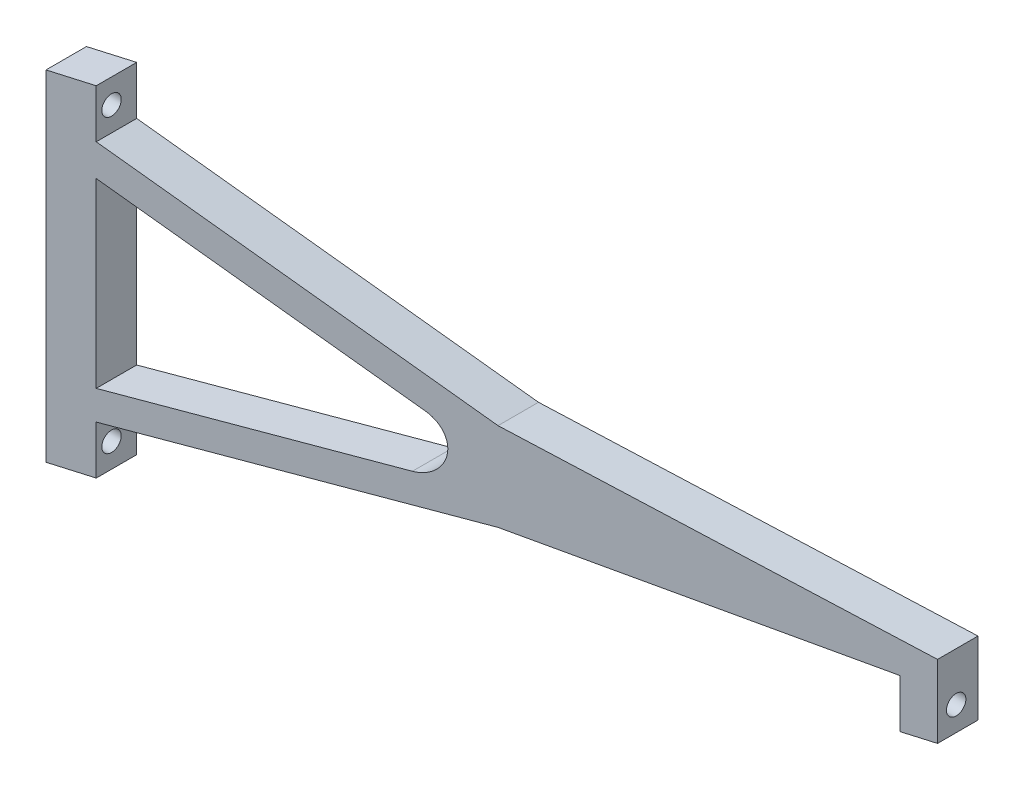
ISO-10303-21;
HEADER;
FILE_DESCRIPTION(('STEP AP214'),'2;1');
FILE_NAME('part.step','',(''),(''),'','','');
FILE_SCHEMA(('AUTOMOTIVE_DESIGN { 1 0 10303 214 1 1 1 1 }'));
ENDSEC;
DATA;
#1=APPLICATION_CONTEXT('core data for automotive mechanical design processes');
#2=APPLICATION_PROTOCOL_DEFINITION('international standard','automotive_design',2000,#1);
#3=PRODUCT_CONTEXT('',#1,'mechanical');
#4=PRODUCT('Part','Part','',(#3));
#5=PRODUCT_RELATED_PRODUCT_CATEGORY('part','',(#4));
#6=PRODUCT_DEFINITION_FORMATION('','',#4);
#7=PRODUCT_DEFINITION_CONTEXT('part definition',#1,'design');
#8=PRODUCT_DEFINITION('design','',#6,#7);
#9=PRODUCT_DEFINITION_SHAPE('','',#8);
#10=(LENGTH_UNIT() NAMED_UNIT(*) SI_UNIT(.MILLI.,.METRE.));
#11=(NAMED_UNIT(*) PLANE_ANGLE_UNIT() SI_UNIT($,.RADIAN.));
#12=(NAMED_UNIT(*) SI_UNIT($,.STERADIAN.) SOLID_ANGLE_UNIT());
#13=UNCERTAINTY_MEASURE_WITH_UNIT(LENGTH_MEASURE(1.E-05),#10,'distance_accuracy_value','');
#14=(GEOMETRIC_REPRESENTATION_CONTEXT(3) GLOBAL_UNCERTAINTY_ASSIGNED_CONTEXT((#13)) GLOBAL_UNIT_ASSIGNED_CONTEXT((#10,
#11,#12)) REPRESENTATION_CONTEXT('',''));
#15=CARTESIAN_POINT('',(0.,0.,0.));
#16=DIRECTION('',(0.,0.,1.));
#17=DIRECTION('',(1.,0.,0.));
#18=AXIS2_PLACEMENT_3D('',#15,#16,#17);
#19=CARTESIAN_POINT('',(-64.,16.0106379265945,30.));
#20=DIRECTION('',(-0.0594690450469109,0.99823015015637,0.));
#21=DIRECTION('',(-0.99823015015637,-0.0594690450469109,0.));
#22=AXIS2_PLACEMENT_3D('',#19,#20,#21);
#23=PLANE('',#22);
#24=DIRECTION('',(0.957987763405682,0.0570716256641193,-0.28107343294775));
#25=VECTOR('',#24,1.);
#26=CARTESIAN_POINT('',(-69.5695897519318,15.6788324969563,10.949691869991));
#27=LINE('',#26,#25);
#28=CARTESIAN_POINT('',(-64.,16.0106379265945,9.31557526486776));
#29=VERTEX_POINT('',#28);
#30=CARTESIAN_POINT('',(-13.6431857297185,19.0106190990618,-5.45910474664132));
#31=VERTEX_POINT('',#30);
#32=EDGE_CURVE('E12',#29,#31,#27,.T.);
#33=ORIENTED_EDGE('',*,*,#32,.F.);
#34=DIRECTION('',(0.,0.,-1.));
#35=VECTOR('',#34,1.);
#36=CARTESIAN_POINT('',(-64.,16.0106379265945,30.));
#37=LINE('',#36,#35);
#38=CARTESIAN_POINT('',(-64.,16.0106379265945,17.6528014767243));
#39=VERTEX_POINT('',#38);
#40=EDGE_CURVE('E213',#39,#29,#37,.T.);
#41=ORIENTED_EDGE('',*,*,#40,.F.);
#42=DIRECTION('',(-0.957987763405682,-0.0570716256641193,0.281073432947749));
#43=VECTOR('',#42,1.);
#44=CARTESIAN_POINT('',(-67.324667291496,15.8125725917687,18.6282582463471));
#45=LINE('',#44,#43);
#46=CARTESIAN_POINT('',(-13.6431857297185,19.0106190990618,2.87812146521523));
#47=VERTEX_POINT('',#46);
#48=EDGE_CURVE('E44',#47,#39,#45,.T.);
#49=ORIENTED_EDGE('',*,*,#48,.F.);
#50=DIRECTION('',(0.,0.,-1.));
#51=VECTOR('',#50,1.);
#52=CARTESIAN_POINT('',(-13.6431857297185,19.0106190990618,30.));
#53=LINE('',#52,#51);
#54=EDGE_CURVE('E219',#47,#31,#53,.T.);
#55=ORIENTED_EDGE('',*,*,#54,.T.);
#56=EDGE_LOOP('',(#33,#41,#49,#55));
#57=FACE_BOUND('',#56,.T.);
#58=ADVANCED_FACE('F36',(#57),#23,.T.);
#59=CARTESIAN_POINT('',(-64.,53.4497295583817,30.));
#60=DIRECTION('',(1.,0.,0.));
#61=DIRECTION('',(0.,0.,-1.));
#62=AXIS2_PLACEMENT_3D('',#59,#60,#61);
#63=PLANE('',#62);
#64=DIRECTION('',(0.,-1.,0.));
#65=VECTOR('',#64,1.);
#66=CARTESIAN_POINT('',(-64.,53.4497295583817,9.31557526486777));
#67=LINE('',#66,#65);
#68=CARTESIAN_POINT('',(-64.,53.4497295583817,9.31557526486777));
#69=VERTEX_POINT('',#68);
#70=EDGE_CURVE('E281',#69,#29,#67,.T.);
#71=ORIENTED_EDGE('',*,*,#70,.F.);
#72=DIRECTION('',(0.,0.,-1.));
#73=VECTOR('',#72,1.);
#74=CARTESIAN_POINT('',(-64.,53.4497295583817,30.));
#75=LINE('',#74,#73);
#76=CARTESIAN_POINT('',(-64.,53.4497295583817,17.6528014767243));
#77=VERTEX_POINT('',#76);
#78=EDGE_CURVE('E215',#77,#69,#75,.T.);
#79=ORIENTED_EDGE('',*,*,#78,.F.);
#80=DIRECTION('',(0.,1.,0.));
#81=VECTOR('',#80,1.);
#82=CARTESIAN_POINT('',(-64.,53.4497295583817,17.6528014767243));
#83=LINE('',#82,#81);
#84=EDGE_CURVE('E157',#39,#77,#83,.T.);
#85=ORIENTED_EDGE('',*,*,#84,.F.);
#86=ORIENTED_EDGE('',*,*,#40,.T.);
#87=EDGE_LOOP('',(#71,#79,#85,#86));
#88=FACE_BOUND('',#87,.T.);
#89=ADVANCED_FACE('F212',(#88),#63,.T.);
#90=CARTESIAN_POINT('',(-11.5928306007203,30.4959562846853,30.));
#91=DIRECTION('',(-0.401194899879948,-0.915992714114211,0.));
#92=DIRECTION('',(0.915992714114211,-0.401194899879948,0.));
#93=AXIS2_PLACEMENT_3D('',#90,#91,#92);
#94=PLANE('',#93);
#95=DIRECTION('',(-0.884603208938995,0.387446636174346,0.259542418213318));
#96=VECTOR('',#95,1.);
#97=CARTESIAN_POINT('',(-19.8720759330204,34.1221761781325,-3.63154951078674));
#98=LINE('',#97,#96);
#99=CARTESIAN_POINT('',(-11.5928306007203,30.4959562846853,-6.06067856301324));
#100=VERTEX_POINT('',#99);
#101=EDGE_CURVE('E283',#100,#69,#98,.T.);
#102=ORIENTED_EDGE('',*,*,#101,.F.);
#103=DIRECTION('',(0.,0.,-1.));
#104=VECTOR('',#103,1.);
#105=CARTESIAN_POINT('',(-11.5928306007203,30.4959562846853,30.));
#106=LINE('',#105,#104);
#107=CARTESIAN_POINT('',(-11.5928306007203,30.4959562846853,2.2765476488433));
#108=VERTEX_POINT('',#107);
#109=EDGE_CURVE('E221',#108,#100,#106,.T.);
#110=ORIENTED_EDGE('',*,*,#109,.F.);
#111=DIRECTION('',(0.884603208938995,-0.387446636174346,-0.259542418213318));
#112=VECTOR('',#111,1.);
#113=CARTESIAN_POINT('',(-17.9579150256424,33.2837944074519,4.14406224418109));
#114=LINE('',#113,#112);
#115=EDGE_CURVE('E216',#77,#108,#114,.T.);
#116=ORIENTED_EDGE('',*,*,#115,.F.);
#117=ORIENTED_EDGE('',*,*,#78,.T.);
#118=EDGE_LOOP('',(#102,#110,#116,#117));
#119=FACE_BOUND('',#118,.T.);
#120=ADVANCED_FACE('F323',(#119),#94,.T.);
#121=CARTESIAN_POINT('',(-14.,25.,30.));
#122=DIRECTION('',(0.,0.,-1.));
#123=DIRECTION('',(-1.,0.,0.));
#124=AXIS2_PLACEMENT_3D('',#121,#122,#123);
#125=CYLINDRICAL_SURFACE('',#124,6.);
#126=CARTESIAN_POINT('',(-14.,25.,-5.35441550560528));
#127=DIRECTION('',(0.281532306264845,0.,0.959551749792161));
#128=DIRECTION('',(0.959551749792161,0.,-0.281532306264845));
#129=AXIS2_PLACEMENT_3D('',#126,#127,#128);
#130=ELLIPSE('',#129,6.25291965889239,6.);
#131=EDGE_CURVE('E285',#31,#100,#130,.T.);
#132=ORIENTED_EDGE('',*,*,#131,.F.);
#133=ORIENTED_EDGE('',*,*,#54,.F.);
#134=CARTESIAN_POINT('',(-14.,25.,2.98281070625127));
#135=DIRECTION('',(-0.281532306264845,0.,-0.959551749792161));
#136=DIRECTION('',(0.959551749792161,0.,-0.281532306264845));
#137=AXIS2_PLACEMENT_3D('',#134,#135,#136);
#138=ELLIPSE('',#137,6.25291965889239,6.);
#139=EDGE_CURVE('E203',#108,#47,#138,.T.);
#140=ORIENTED_EDGE('',*,*,#139,.F.);
#141=ORIENTED_EDGE('',*,*,#109,.T.);
#142=EDGE_LOOP('',(#132,#133,#140,#141));
#143=FACE_BOUND('',#142,.T.);
#144=ADVANCED_FACE('F330',(#143),#125,.F.);
#145=CARTESIAN_POINT('',(70.,70.,-21.6627737881434));
#146=DIRECTION('',(-0.281532306264845,0.,-0.959551749792161));
#147=DIRECTION('',(-0.959551749792161,0.,0.281532306264845));
#148=AXIS2_PLACEMENT_3D('',#145,#146,#147);
#149=PLANE('',#148);
#150=ORIENTED_EDGE('',*,*,#139,.T.);
#151=ORIENTED_EDGE('',*,*,#48,.T.);
#152=ORIENTED_EDGE('',*,*,#84,.T.);
#153=ORIENTED_EDGE('',*,*,#115,.T.);
#154=EDGE_LOOP('',(#150,#151,#152,#153));
#155=FACE_BOUND('',#154,.T.);
#156=DIRECTION('',(0.884603208938995,-0.387446636174346,-0.259542418213318));
#157=VECTOR('',#156,1.);
#158=CARTESIAN_POINT('',(-7.14600377341808,35.0985646802269,0.971849478554998));
#159=LINE('',#158,#157);
#160=CARTESIAN_POINT('',(-64.,60.,17.6528014767243));
#161=VERTEX_POINT('',#160);
#162=CARTESIAN_POINT('',(0.,31.9686923305427,-1.12478670948118));
#163=VERTEX_POINT('',#162);
#164=EDGE_CURVE('E275',#161,#163,#159,.T.);
#165=ORIENTED_EDGE('',*,*,#164,.F.);
#166=DIRECTION('',(0.,-1.,0.));
#167=VECTOR('',#166,1.);
#168=CARTESIAN_POINT('',(-64.,60.,17.6528014767243));
#169=LINE('',#168,#167);
#170=CARTESIAN_POINT('',(-64.,70.,17.6528014767243));
#171=VERTEX_POINT('',#170);
#172=EDGE_CURVE('E272',#171,#161,#169,.T.);
#173=ORIENTED_EDGE('',*,*,#172,.F.);
#174=DIRECTION('',(0.959551749792161,0.,-0.281532306264845));
#175=VECTOR('',#174,1.);
#176=CARTESIAN_POINT('',(70.,70.,-21.6627737881434));
#177=LINE('',#176,#175);
#178=CARTESIAN_POINT('',(-72.,70.,20.));
#179=VERTEX_POINT('',#178);
#180=EDGE_CURVE('E168',#179,#171,#177,.T.);
#181=ORIENTED_EDGE('',*,*,#180,.F.);
#182=DIRECTION('',(0.,-1.,0.));
#183=VECTOR('',#182,1.);
#184=CARTESIAN_POINT('',(-72.,70.,20.));
#185=LINE('',#184,#183);
#186=CARTESIAN_POINT('',(-72.,0.,20.));
#187=VERTEX_POINT('',#186);
#188=EDGE_CURVE('E158',#179,#187,#185,.T.);
#189=ORIENTED_EDGE('',*,*,#188,.T.);
#190=DIRECTION('',(0.959551749792161,0.,-0.281532306264845));
#191=VECTOR('',#190,1.);
#192=CARTESIAN_POINT('',(70.,0.,-21.6627737881434));
#193=LINE('',#192,#191);
#194=CARTESIAN_POINT('',(-64.,0.,17.6528014767243));
#195=VERTEX_POINT('',#194);
#196=EDGE_CURVE('E169',#187,#195,#193,.T.);
#197=ORIENTED_EDGE('',*,*,#196,.T.);
#198=DIRECTION('',(0.,-1.,0.));
#199=VECTOR('',#198,1.);
#200=CARTESIAN_POINT('',(-64.,0.,17.6528014767243));
#201=LINE('',#200,#199);
#202=CARTESIAN_POINT('',(-64.,10.,17.6528014767243));
#203=VERTEX_POINT('',#202);
#204=EDGE_CURVE('E51',#203,#195,#201,.T.);
#205=ORIENTED_EDGE('',*,*,#204,.F.);
#206=DIRECTION('',(-0.957987763405682,-0.0570716256641194,0.281073432947749));
#207=VECTOR('',#206,1.);
#208=CARTESIAN_POINT('',(-67.324667291496,9.80193466517416,18.6282582463471));
#209=LINE('',#208,#207);
#210=CARTESIAN_POINT('',(0.,13.8127669079181,-1.12478670948117));
#211=VERTEX_POINT('',#210);
#212=EDGE_CURVE('E263',#211,#203,#209,.T.);
#213=ORIENTED_EDGE('',*,*,#212,.F.);
#214=DIRECTION('',(-0.957987763405682,0.0570716256641194,0.281073432947749));
#215=VECTOR('',#214,1.);
#216=CARTESIAN_POINT('',(-8.38081287287409,14.3120495014048,1.33414224040131));
#217=LINE('',#216,#215);
#218=CARTESIAN_POINT('',(64.,10.,-19.9023748956867));
#219=VERTEX_POINT('',#218);
#220=EDGE_CURVE('E266',#219,#211,#217,.T.);
#221=ORIENTED_EDGE('',*,*,#220,.F.);
#222=DIRECTION('',(0.,1.,0.));
#223=VECTOR('',#222,1.);
#224=CARTESIAN_POINT('',(64.,10.,-19.9023748956867));
#225=LINE('',#224,#223);
#226=CARTESIAN_POINT('',(64.,0.,-19.9023748956867));
#227=VERTEX_POINT('',#226);
#228=EDGE_CURVE('E269',#227,#219,#225,.T.);
#229=ORIENTED_EDGE('',*,*,#228,.F.);
#230=CARTESIAN_POINT('',(70.,0.,-21.6627737881434));
#231=VERTEX_POINT('',#230);
#232=EDGE_CURVE('E250',#227,#231,#193,.T.);
#233=ORIENTED_EDGE('',*,*,#232,.T.);
#234=DIRECTION('',(0.,-1.,0.));
#235=VECTOR('',#234,1.);
#236=CARTESIAN_POINT('',(70.,70.,-21.6627737881434));
#237=LINE('',#236,#235);
#238=CARTESIAN_POINT('',(70.,15.,-21.6627737881434));
#239=VERTEX_POINT('',#238);
#240=EDGE_CURVE('E257',#239,#231,#237,.T.);
#241=ORIENTED_EDGE('',*,*,#240,.F.);
#242=DIRECTION('',(0.934601477354737,-0.226556641727189,-0.274211900937289));
#243=VECTOR('',#242,1.);
#244=CARTESIAN_POINT('',(56.7599238633365,18.2095254056572,-17.7781378936391));
#245=LINE('',#244,#243);
#246=EDGE_CURVE('E278',#163,#239,#245,.T.);
#247=ORIENTED_EDGE('',*,*,#246,.F.);
#248=EDGE_LOOP('',(#165,#173,#181,#189,#197,#205,#213,#221,#229,#233,#241,#247));
#249=FACE_BOUND('',#248,.T.);
#250=ADVANCED_FACE('F200',(#155,#249),#149,.F.);
#251=CARTESIAN_POINT('',(-72.,70.,11.6627737881435));
#252=DIRECTION('',(0.281532306264845,0.,0.959551749792161));
#253=DIRECTION('',(0.959551749792161,0.,-0.281532306264845));
#254=AXIS2_PLACEMENT_3D('',#251,#252,#253);
#255=PLANE('',#254);
#256=ORIENTED_EDGE('',*,*,#131,.T.);
#257=ORIENTED_EDGE('',*,*,#101,.T.);
#258=ORIENTED_EDGE('',*,*,#70,.T.);
#259=ORIENTED_EDGE('',*,*,#32,.T.);
#260=EDGE_LOOP('',(#256,#257,#258,#259));
#261=FACE_BOUND('',#260,.T.);
#262=DIRECTION('',(0.,1.,0.));
#263=VECTOR('',#262,1.);
#264=CARTESIAN_POINT('',(70.,0.,-30.));
#265=LINE('',#264,#263);
#266=CARTESIAN_POINT('',(70.,0.,-30.));
#267=VERTEX_POINT('',#266);
#268=CARTESIAN_POINT('',(70.,15.,-30.));
#269=VERTEX_POINT('',#268);
#270=EDGE_CURVE('E229',#267,#269,#265,.T.);
#271=ORIENTED_EDGE('',*,*,#270,.F.);
#272=DIRECTION('',(-0.959551749792161,0.,0.281532306264845));
#273=VECTOR('',#272,1.);
#274=CARTESIAN_POINT('',(-72.,0.,11.6627737881435));
#275=LINE('',#274,#273);
#276=CARTESIAN_POINT('',(64.,0.,-28.2396011075432));
#277=VERTEX_POINT('',#276);
#278=EDGE_CURVE('E247',#267,#277,#275,.T.);
#279=ORIENTED_EDGE('',*,*,#278,.T.);
#280=DIRECTION('',(0.,-1.,0.));
#281=VECTOR('',#280,1.);
#282=CARTESIAN_POINT('',(64.,10.,-28.2396011075432));
#283=LINE('',#282,#281);
#284=CARTESIAN_POINT('',(64.,10.,-28.2396011075432));
#285=VERTEX_POINT('',#284);
#286=EDGE_CURVE('E291',#285,#277,#283,.T.);
#287=ORIENTED_EDGE('',*,*,#286,.F.);
#288=DIRECTION('',(0.957987763405682,-0.0570716256641194,-0.28107343294775));
#289=VECTOR('',#288,1.);
#290=CARTESIAN_POINT('',(-10.62573533331,14.4457895962171,-6.3444241359548));
#291=LINE('',#290,#289);
#292=CARTESIAN_POINT('',(0.,13.8127669079181,-9.46201292133772));
#293=VERTEX_POINT('',#292);
#294=EDGE_CURVE('E59',#293,#285,#291,.T.);
#295=ORIENTED_EDGE('',*,*,#294,.F.);
#296=DIRECTION('',(0.957987763405682,0.0570716256641194,-0.28107343294775));
#297=VECTOR('',#296,1.);
#298=CARTESIAN_POINT('',(-69.5695897519318,9.66819457036179,10.949691869991));
#299=LINE('',#298,#297);
#300=CARTESIAN_POINT('',(-64.,10.,9.31557526486777));
#301=VERTEX_POINT('',#300);
#302=EDGE_CURVE('E287',#301,#293,#299,.T.);
#303=ORIENTED_EDGE('',*,*,#302,.F.);
#304=DIRECTION('',(0.,1.,0.));
#305=VECTOR('',#304,1.);
#306=CARTESIAN_POINT('',(-64.,0.,9.31557526486777));
#307=LINE('',#306,#305);
#308=CARTESIAN_POINT('',(-64.,0.,9.31557526486776));
#309=VERTEX_POINT('',#308);
#310=EDGE_CURVE('E243',#309,#301,#307,.T.);
#311=ORIENTED_EDGE('',*,*,#310,.F.);
#312=CARTESIAN_POINT('',(-72.,0.,11.6627737881435));
#313=VERTEX_POINT('',#312);
#314=EDGE_CURVE('E152',#309,#313,#275,.T.);
#315=ORIENTED_EDGE('',*,*,#314,.T.);
#316=DIRECTION('',(0.,-1.,0.));
#317=VECTOR('',#316,1.);
#318=CARTESIAN_POINT('',(-72.,70.,11.6627737881435));
#319=LINE('',#318,#317);
#320=CARTESIAN_POINT('',(-72.,70.,11.6627737881435));
#321=VERTEX_POINT('',#320);
#322=EDGE_CURVE('E146',#321,#313,#319,.T.);
#323=ORIENTED_EDGE('',*,*,#322,.F.);
#324=DIRECTION('',(-0.959551749792161,0.,0.281532306264845));
#325=VECTOR('',#324,1.);
#326=CARTESIAN_POINT('',(-72.,70.,11.6627737881435));
#327=LINE('',#326,#325);
#328=CARTESIAN_POINT('',(-64.,70.,9.31557526486776));
#329=VERTEX_POINT('',#328);
#330=EDGE_CURVE('E149',#329,#321,#327,.T.);
#331=ORIENTED_EDGE('',*,*,#330,.F.);
#332=DIRECTION('',(0.,1.,0.));
#333=VECTOR('',#332,1.);
#334=CARTESIAN_POINT('',(-64.,60.,9.31557526486777));
#335=LINE('',#334,#333);
#336=CARTESIAN_POINT('',(-64.,60.,9.31557526486777));
#337=VERTEX_POINT('',#336);
#338=EDGE_CURVE('E294',#337,#329,#335,.T.);
#339=ORIENTED_EDGE('',*,*,#338,.F.);
#340=DIRECTION('',(-0.884603208938995,0.387446636174346,0.259542418213318));
#341=VECTOR('',#340,1.);
#342=CARTESIAN_POINT('',(-9.06016468079608,35.9369464509075,-6.80376227641284));
#343=LINE('',#342,#341);
#344=CARTESIAN_POINT('',(0.,31.9686923305427,-9.46201292133773));
#345=VERTEX_POINT('',#344);
#346=EDGE_CURVE('E296',#345,#337,#343,.T.);
#347=ORIENTED_EDGE('',*,*,#346,.F.);
#348=DIRECTION('',(-0.934601477354737,0.226556641727189,0.274211900937289));
#349=VECTOR('',#348,1.);
#350=CARTESIAN_POINT('',(54.6232691365455,18.7274716438789,-25.4884700030615));
#351=LINE('',#350,#349);
#352=EDGE_CURVE('E223',#269,#345,#351,.T.);
#353=ORIENTED_EDGE('',*,*,#352,.F.);
#354=EDGE_LOOP('',(#271,#279,#287,#295,#303,#311,#315,#323,#331,#339,#347,#353));
#355=FACE_BOUND('',#354,.T.);
#356=ADVANCED_FACE('F148',(#261,#355),#255,.F.);
#357=CARTESIAN_POINT('',(0.,13.8127669079181,30.));
#358=DIRECTION('',(0.0594690450469109,0.99823015015637,0.));
#359=DIRECTION('',(-0.99823015015637,0.0594690450469109,0.));
#360=AXIS2_PLACEMENT_3D('',#357,#358,#359);
#361=PLANE('',#360);
#362=DIRECTION('',(0.,0.,-1.));
#363=VECTOR('',#362,1.);
#364=CARTESIAN_POINT('',(0.,13.8127669079181,30.));
#365=LINE('',#364,#363);
#366=EDGE_CURVE('E232',#211,#293,#365,.T.);
#367=ORIENTED_EDGE('',*,*,#366,.T.);
#368=ORIENTED_EDGE('',*,*,#294,.T.);
#369=DIRECTION('',(0.,0.,-1.));
#370=VECTOR('',#369,1.);
#371=CARTESIAN_POINT('',(64.,10.,30.));
#372=LINE('',#371,#370);
#373=EDGE_CURVE('E195',#219,#285,#372,.T.);
#374=ORIENTED_EDGE('',*,*,#373,.F.);
#375=ORIENTED_EDGE('',*,*,#220,.T.);
#376=EDGE_LOOP('',(#367,#368,#374,#375));
#377=FACE_BOUND('',#376,.T.);
#378=ADVANCED_FACE('F38',(#377),#361,.F.);
#379=CARTESIAN_POINT('',(64.,10.,30.));
#380=DIRECTION('',(1.,0.,0.));
#381=DIRECTION('',(0.,0.,-1.));
#382=AXIS2_PLACEMENT_3D('',#379,#380,#381);
#383=PLANE('',#382);
#384=CARTESIAN_POINT('',(64.,5.,-25.5));
#385=DIRECTION('',(1.,0.,0.));
#386=DIRECTION('',(0.,0.,-1.));
#387=AXIS2_PLACEMENT_3D('',#384,#385,#386);
#388=CIRCLE('',#387,2.);
#389=CARTESIAN_POINT('',(64.,5.,-27.5));
#390=VERTEX_POINT('',#389);
#391=EDGE_CURVE('E360',#390,#390,#388,.F.);
#392=ORIENTED_EDGE('',*,*,#391,.F.);
#393=EDGE_LOOP('',(#392));
#394=FACE_BOUND('',#393,.T.);
#395=ORIENTED_EDGE('',*,*,#373,.T.);
#396=ORIENTED_EDGE('',*,*,#286,.T.);
#397=DIRECTION('',(0.,0.,-1.));
#398=VECTOR('',#397,1.);
#399=CARTESIAN_POINT('',(64.,0.,30.));
#400=LINE('',#399,#398);
#401=EDGE_CURVE('E192',#227,#277,#400,.T.);
#402=ORIENTED_EDGE('',*,*,#401,.F.);
#403=ORIENTED_EDGE('',*,*,#228,.T.);
#404=EDGE_LOOP('',(#395,#396,#402,#403));
#405=FACE_BOUND('',#404,.T.);
#406=ADVANCED_FACE('F383',(#394,#405),#383,.F.);
#407=CARTESIAN_POINT('',(64.,0.,30.));
#408=DIRECTION('',(0.,1.,0.));
#409=DIRECTION('',(0.,0.,1.));
#410=AXIS2_PLACEMENT_3D('',#407,#408,#409);
#411=PLANE('',#410);
#412=ORIENTED_EDGE('',*,*,#401,.T.);
#413=ORIENTED_EDGE('',*,*,#278,.F.);
#414=DIRECTION('',(0.,0.,-1.));
#415=VECTOR('',#414,1.);
#416=CARTESIAN_POINT('',(70.,0.,30.));
#417=LINE('',#416,#415);
#418=EDGE_CURVE('E189',#231,#267,#417,.T.);
#419=ORIENTED_EDGE('',*,*,#418,.F.);
#420=ORIENTED_EDGE('',*,*,#232,.F.);
#421=EDGE_LOOP('',(#412,#413,#419,#420));
#422=FACE_BOUND('',#421,.T.);
#423=ADVANCED_FACE('F375',(#422),#411,.F.);
#424=CARTESIAN_POINT('',(70.,0.,30.));
#425=DIRECTION('',(-1.,0.,0.));
#426=DIRECTION('',(0.,0.,1.));
#427=AXIS2_PLACEMENT_3D('',#424,#425,#426);
#428=PLANE('',#427);
#429=CARTESIAN_POINT('',(70.,5.,-25.5));
#430=DIRECTION('',(1.,0.,0.));
#431=DIRECTION('',(0.,0.,-1.));
#432=AXIS2_PLACEMENT_3D('',#429,#430,#431);
#433=CIRCLE('',#432,2.);
#434=CARTESIAN_POINT('',(70.,5.,-27.5));
#435=VERTEX_POINT('',#434);
#436=EDGE_CURVE('E365',#435,#435,#433,.T.);
#437=ORIENTED_EDGE('',*,*,#436,.F.);
#438=EDGE_LOOP('',(#437));
#439=FACE_BOUND('',#438,.T.);
#440=DIRECTION('',(0.,0.,-1.));
#441=VECTOR('',#440,1.);
#442=CARTESIAN_POINT('',(70.,15.,30.));
#443=LINE('',#442,#441);
#444=EDGE_CURVE('E186',#239,#269,#443,.T.);
#445=ORIENTED_EDGE('',*,*,#444,.F.);
#446=ORIENTED_EDGE('',*,*,#240,.T.);
#447=ORIENTED_EDGE('',*,*,#418,.T.);
#448=ORIENTED_EDGE('',*,*,#270,.T.);
#449=EDGE_LOOP('',(#445,#446,#447,#448));
#450=FACE_BOUND('',#449,.T.);
#451=ADVANCED_FACE('F372',(#439,#450),#428,.F.);
#452=CARTESIAN_POINT('',(70.,15.,30.));
#453=DIRECTION('',(-0.235586851791364,-0.971853299249961,0.));
#454=DIRECTION('',(0.971853299249961,-0.235586851791364,0.));
#455=AXIS2_PLACEMENT_3D('',#452,#453,#454);
#456=PLANE('',#455);
#457=ORIENTED_EDGE('',*,*,#444,.T.);
#458=ORIENTED_EDGE('',*,*,#352,.T.);
#459=DIRECTION('',(0.,0.,-1.));
#460=VECTOR('',#459,1.);
#461=CARTESIAN_POINT('',(0.,31.9686923305427,30.));
#462=LINE('',#461,#460);
#463=EDGE_CURVE('E183',#163,#345,#462,.T.);
#464=ORIENTED_EDGE('',*,*,#463,.F.);
#465=ORIENTED_EDGE('',*,*,#246,.T.);
#466=EDGE_LOOP('',(#457,#458,#464,#465));
#467=FACE_BOUND('',#466,.T.);
#468=ADVANCED_FACE('F301',(#467),#456,.F.);
#469=CARTESIAN_POINT('',(0.,31.9686923305427,30.));
#470=DIRECTION('',(-0.401194899879948,-0.915992714114211,0.));
#471=DIRECTION('',(0.915992714114211,-0.401194899879948,0.));
#472=AXIS2_PLACEMENT_3D('',#469,#470,#471);
#473=PLANE('',#472);
#474=ORIENTED_EDGE('',*,*,#463,.T.);
#475=ORIENTED_EDGE('',*,*,#346,.T.);
#476=DIRECTION('',(0.,0.,-1.));
#477=VECTOR('',#476,1.);
#478=CARTESIAN_POINT('',(-64.,60.,30.));
#479=LINE('',#478,#477);
#480=EDGE_CURVE('E175',#161,#337,#479,.T.);
#481=ORIENTED_EDGE('',*,*,#480,.F.);
#482=ORIENTED_EDGE('',*,*,#164,.T.);
#483=EDGE_LOOP('',(#474,#475,#481,#482));
#484=FACE_BOUND('',#483,.T.);
#485=ADVANCED_FACE('F304',(#484),#473,.F.);
#486=CARTESIAN_POINT('',(-64.,60.,30.));
#487=DIRECTION('',(-1.,0.,0.));
#488=DIRECTION('',(0.,0.,1.));
#489=AXIS2_PLACEMENT_3D('',#486,#487,#488);
#490=PLANE('',#489);
#491=CARTESIAN_POINT('',(-64.,65.,14.5));
#492=DIRECTION('',(1.,0.,0.));
#493=DIRECTION('',(0.,0.,-1.));
#494=AXIS2_PLACEMENT_3D('',#491,#492,#493);
#495=CIRCLE('',#494,2.);
#496=CARTESIAN_POINT('',(-64.,65.,12.5));
#497=VERTEX_POINT('',#496);
#498=EDGE_CURVE('E252',#497,#497,#495,.T.);
#499=ORIENTED_EDGE('',*,*,#498,.F.);
#500=EDGE_LOOP('',(#499));
#501=FACE_BOUND('',#500,.T.);
#502=ORIENTED_EDGE('',*,*,#480,.T.);
#503=ORIENTED_EDGE('',*,*,#338,.T.);
#504=DIRECTION('',(0.,0.,-1.));
#505=VECTOR('',#504,1.);
#506=CARTESIAN_POINT('',(-64.,70.,30.));
#507=LINE('',#506,#505);
#508=EDGE_CURVE('E167',#171,#329,#507,.T.);
#509=ORIENTED_EDGE('',*,*,#508,.F.);
#510=ORIENTED_EDGE('',*,*,#172,.T.);
#511=EDGE_LOOP('',(#502,#503,#509,#510));
#512=FACE_BOUND('',#511,.T.);
#513=ADVANCED_FACE('F307',(#501,#512),#490,.F.);
#514=CARTESIAN_POINT('',(-64.,70.,30.));
#515=DIRECTION('',(0.,-1.,0.));
#516=DIRECTION('',(0.,0.,-1.));
#517=AXIS2_PLACEMENT_3D('',#514,#515,#516);
#518=PLANE('',#517);
#519=ORIENTED_EDGE('',*,*,#508,.T.);
#520=ORIENTED_EDGE('',*,*,#330,.T.);
#521=DIRECTION('',(0.,0.,-1.));
#522=VECTOR('',#521,1.);
#523=CARTESIAN_POINT('',(-72.,70.,30.));
#524=LINE('',#523,#522);
#525=EDGE_CURVE('E165',#179,#321,#524,.T.);
#526=ORIENTED_EDGE('',*,*,#525,.F.);
#527=ORIENTED_EDGE('',*,*,#180,.T.);
#528=EDGE_LOOP('',(#519,#520,#526,#527));
#529=FACE_BOUND('',#528,.T.);
#530=ADVANCED_FACE('F163',(#529),#518,.F.);
#531=CARTESIAN_POINT('',(-72.,70.,30.));
#532=DIRECTION('',(1.,0.,0.));
#533=DIRECTION('',(0.,1.,0.));
#534=AXIS2_PLACEMENT_3D('',#531,#532,#533);
#535=PLANE('',#534);
#536=CARTESIAN_POINT('',(-72.,65.,14.5));
#537=DIRECTION('',(1.,0.,0.));
#538=DIRECTION('',(0.,0.,-1.));
#539=AXIS2_PLACEMENT_3D('',#536,#537,#538);
#540=CIRCLE('',#539,2.);
#541=CARTESIAN_POINT('',(-72.,65.,12.5));
#542=VERTEX_POINT('',#541);
#543=EDGE_CURVE('E248',#542,#542,#540,.T.);
#544=ORIENTED_EDGE('',*,*,#543,.T.);
#545=EDGE_LOOP('',(#544));
#546=FACE_BOUND('',#545,.T.);
#547=CARTESIAN_POINT('',(-72.,5.,14.5));
#548=DIRECTION('',(1.,0.,0.));
#549=DIRECTION('',(0.,0.,-1.));
#550=AXIS2_PLACEMENT_3D('',#547,#548,#549);
#551=CIRCLE('',#550,2.);
#552=CARTESIAN_POINT('',(-72.,5.,12.5));
#553=VERTEX_POINT('',#552);
#554=EDGE_CURVE('E353',#553,#553,#551,.T.);
#555=ORIENTED_EDGE('',*,*,#554,.T.);
#556=EDGE_LOOP('',(#555));
#557=FACE_BOUND('',#556,.T.);
#558=ORIENTED_EDGE('',*,*,#525,.T.);
#559=ORIENTED_EDGE('',*,*,#322,.T.);
#560=DIRECTION('',(0.,0.,-1.));
#561=VECTOR('',#560,1.);
#562=CARTESIAN_POINT('',(-72.,0.,30.));
#563=LINE('',#562,#561);
#564=EDGE_CURVE('E173',#187,#313,#563,.T.);
#565=ORIENTED_EDGE('',*,*,#564,.F.);
#566=ORIENTED_EDGE('',*,*,#188,.F.);
#567=EDGE_LOOP('',(#558,#559,#565,#566));
#568=FACE_BOUND('',#567,.T.);
#569=ADVANCED_FACE('F172',(#546,#557,#568),#535,.F.);
#570=CARTESIAN_POINT('',(-72.,0.,30.));
#571=DIRECTION('',(0.,1.,0.));
#572=DIRECTION('',(0.,0.,1.));
#573=AXIS2_PLACEMENT_3D('',#570,#571,#572);
#574=PLANE('',#573);
#575=ORIENTED_EDGE('',*,*,#564,.T.);
#576=ORIENTED_EDGE('',*,*,#314,.F.);
#577=DIRECTION('',(0.,0.,-1.));
#578=VECTOR('',#577,1.);
#579=CARTESIAN_POINT('',(-64.,0.,30.));
#580=LINE('',#579,#578);
#581=EDGE_CURVE('E177',#195,#309,#580,.T.);
#582=ORIENTED_EDGE('',*,*,#581,.F.);
#583=ORIENTED_EDGE('',*,*,#196,.F.);
#584=EDGE_LOOP('',(#575,#576,#582,#583));
#585=FACE_BOUND('',#584,.T.);
#586=ADVANCED_FACE('F246',(#585),#574,.F.);
#587=CARTESIAN_POINT('',(-64.,0.,30.));
#588=DIRECTION('',(-1.,0.,0.));
#589=DIRECTION('',(0.,0.,1.));
#590=AXIS2_PLACEMENT_3D('',#587,#588,#589);
#591=PLANE('',#590);
#592=CARTESIAN_POINT('',(-64.,5.,14.5));
#593=DIRECTION('',(1.,0.,0.));
#594=DIRECTION('',(0.,0.,-1.));
#595=AXIS2_PLACEMENT_3D('',#592,#593,#594);
#596=CIRCLE('',#595,2.);
#597=CARTESIAN_POINT('',(-64.,5.,12.5));
#598=VERTEX_POINT('',#597);
#599=EDGE_CURVE('E355',#598,#598,#596,.T.);
#600=ORIENTED_EDGE('',*,*,#599,.F.);
#601=EDGE_LOOP('',(#600));
#602=FACE_BOUND('',#601,.T.);
#603=ORIENTED_EDGE('',*,*,#581,.T.);
#604=ORIENTED_EDGE('',*,*,#310,.T.);
#605=DIRECTION('',(0.,0.,-1.));
#606=VECTOR('',#605,1.);
#607=CARTESIAN_POINT('',(-64.,10.,30.));
#608=LINE('',#607,#606);
#609=EDGE_CURVE('E235',#203,#301,#608,.T.);
#610=ORIENTED_EDGE('',*,*,#609,.F.);
#611=ORIENTED_EDGE('',*,*,#204,.T.);
#612=EDGE_LOOP('',(#603,#604,#610,#611));
#613=FACE_BOUND('',#612,.T.);
#614=ADVANCED_FACE('F241',(#602,#613),#591,.F.);
#615=CARTESIAN_POINT('',(-64.,10.,30.));
#616=DIRECTION('',(-0.059469045046911,0.99823015015637,0.));
#617=DIRECTION('',(-0.99823015015637,-0.059469045046911,0.));
#618=AXIS2_PLACEMENT_3D('',#615,#616,#617);
#619=PLANE('',#618);
#620=ORIENTED_EDGE('',*,*,#609,.T.);
#621=ORIENTED_EDGE('',*,*,#302,.T.);
#622=ORIENTED_EDGE('',*,*,#366,.F.);
#623=ORIENTED_EDGE('',*,*,#212,.T.);
#624=EDGE_LOOP('',(#620,#621,#622,#623));
#625=FACE_BOUND('',#624,.T.);
#626=ADVANCED_FACE('F335',(#625),#619,.F.);
#627=CARTESIAN_POINT('',(-72.,5.,14.5));
#628=DIRECTION('',(1.,0.,0.));
#629=DIRECTION('',(0.,0.,-1.));
#630=AXIS2_PLACEMENT_3D('',#627,#628,#629);
#631=CYLINDRICAL_SURFACE('',#630,2.);
#632=ORIENTED_EDGE('',*,*,#554,.F.);
#633=EDGE_LOOP('',(#632));
#634=FACE_BOUND('',#633,.T.);
#635=ORIENTED_EDGE('',*,*,#599,.T.);
#636=EDGE_LOOP('',(#635));
#637=FACE_BOUND('',#636,.T.);
#638=ADVANCED_FACE('F338',(#634,#637),#631,.F.);
#639=CARTESIAN_POINT('',(-72.,65.,14.5));
#640=DIRECTION('',(1.,0.,0.));
#641=DIRECTION('',(0.,0.,-1.));
#642=AXIS2_PLACEMENT_3D('',#639,#640,#641);
#643=CYLINDRICAL_SURFACE('',#642,2.);
#644=ORIENTED_EDGE('',*,*,#543,.F.);
#645=EDGE_LOOP('',(#644));
#646=FACE_BOUND('',#645,.T.);
#647=ORIENTED_EDGE('',*,*,#498,.T.);
#648=EDGE_LOOP('',(#647));
#649=FACE_BOUND('',#648,.T.);
#650=ADVANCED_FACE('F405',(#646,#649),#643,.F.);
#651=CARTESIAN_POINT('',(-72.001,5.,-25.5));
#652=DIRECTION('',(1.,0.,0.));
#653=DIRECTION('',(0.,0.,-1.));
#654=AXIS2_PLACEMENT_3D('',#651,#652,#653);
#655=CYLINDRICAL_SURFACE('',#654,2.);
#656=ORIENTED_EDGE('',*,*,#436,.T.);
#657=EDGE_LOOP('',(#656));
#658=FACE_BOUND('',#657,.T.);
#659=ORIENTED_EDGE('',*,*,#391,.T.);
#660=EDGE_LOOP('',(#659));
#661=FACE_BOUND('',#660,.T.);
#662=ADVANCED_FACE('F369',(#658,#661),#655,.F.);
#663=CLOSED_SHELL('',(#58,#89,#120,#144,#250,#356,#378,#406,#423,#451,#468,#485,#513,#530,#569,
#586,#614,#626,#638,#650,#662));
#664=MANIFOLD_SOLID_BREP('B2',#663);
#665=ADVANCED_BREP_SHAPE_REPRESENTATION('',(#18,#664),#14);
#666=SHAPE_DEFINITION_REPRESENTATION(#9,#665);
ENDSEC;
END-ISO-10303-21;
